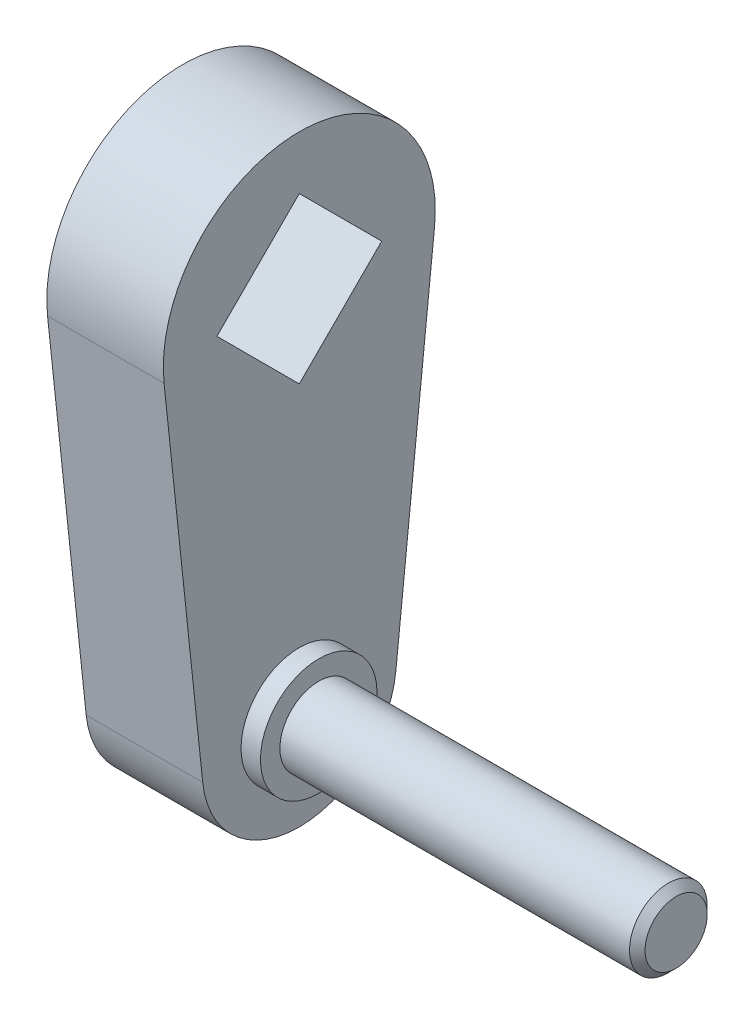
ISO-10303-21;
HEADER;
FILE_DESCRIPTION(('STEP AP214'),'2;1');
FILE_NAME('part.step','',(''),(''),'','','');
FILE_SCHEMA(('AUTOMOTIVE_DESIGN { 1 0 10303 214 1 1 1 1 }'));
ENDSEC;
DATA;
#1=APPLICATION_CONTEXT('core data for automotive mechanical design processes');
#2=APPLICATION_PROTOCOL_DEFINITION('international standard','automotive_design',2000,#1);
#3=PRODUCT_CONTEXT('',#1,'mechanical');
#4=PRODUCT('Part','Part','',(#3));
#5=PRODUCT_RELATED_PRODUCT_CATEGORY('part','',(#4));
#6=PRODUCT_DEFINITION_FORMATION('','',#4);
#7=PRODUCT_DEFINITION_CONTEXT('part definition',#1,'design');
#8=PRODUCT_DEFINITION('design','',#6,#7);
#9=PRODUCT_DEFINITION_SHAPE('','',#8);
#10=(LENGTH_UNIT() NAMED_UNIT(*) SI_UNIT(.MILLI.,.METRE.));
#11=(NAMED_UNIT(*) PLANE_ANGLE_UNIT() SI_UNIT($,.RADIAN.));
#12=(NAMED_UNIT(*) SI_UNIT($,.STERADIAN.) SOLID_ANGLE_UNIT());
#13=UNCERTAINTY_MEASURE_WITH_UNIT(LENGTH_MEASURE(1.E-05),#10,'distance_accuracy_value','');
#14=(GEOMETRIC_REPRESENTATION_CONTEXT(3) GLOBAL_UNCERTAINTY_ASSIGNED_CONTEXT((#13)) GLOBAL_UNIT_ASSIGNED_CONTEXT((#10,
#11,#12)) REPRESENTATION_CONTEXT('',''));
#15=CARTESIAN_POINT('',(0.,0.,0.));
#16=DIRECTION('',(0.,0.,1.));
#17=DIRECTION('',(1.,0.,0.));
#18=AXIS2_PLACEMENT_3D('',#15,#16,#17);
#19=CARTESIAN_POINT('',(5.,-95.,0.));
#20=DIRECTION('',(1.,0.,0.));
#21=DIRECTION('',(0.,0.,-1.));
#22=AXIS2_PLACEMENT_3D('',#19,#20,#21);
#23=PLANE('',#22);
#24=CARTESIAN_POINT('',(5.,-95.,0.));
#25=DIRECTION('',(1.,0.,0.));
#26=DIRECTION('',(0.,0.,-1.));
#27=AXIS2_PLACEMENT_3D('',#24,#25,#26);
#28=CIRCLE('',#27,15.);
#29=CARTESIAN_POINT('',(5.,-95.,-15.));
#30=VERTEX_POINT('',#29);
#31=EDGE_CURVE('E123',#30,#30,#28,.T.);
#32=ORIENTED_EDGE('',*,*,#31,.T.);
#33=EDGE_LOOP('',(#32));
#34=FACE_BOUND('',#33,.T.);
#35=CARTESIAN_POINT('',(5.,-95.,0.));
#36=DIRECTION('',(1.,0.,0.));
#37=DIRECTION('',(0.,0.,-1.));
#38=AXIS2_PLACEMENT_3D('',#35,#36,#37);
#39=CIRCLE('',#38,10.);
#40=CARTESIAN_POINT('',(5.,-95.,-10.));
#41=VERTEX_POINT('',#40);
#42=EDGE_CURVE('E364',#41,#41,#39,.T.);
#43=ORIENTED_EDGE('',*,*,#42,.F.);
#44=EDGE_LOOP('',(#43));
#45=FACE_BOUND('',#44,.T.);
#46=ADVANCED_FACE('F34',(#34,#45),#23,.T.);
#47=CARTESIAN_POINT('',(0.,0.,0.));
#48=DIRECTION('',(-1.,0.,0.));
#49=DIRECTION('',(0.,0.,1.));
#50=AXIS2_PLACEMENT_3D('',#47,#48,#49);
#51=PLANE('',#50);
#52=CARTESIAN_POINT('',(0.,0.,0.));
#53=DIRECTION('',(1.,0.,0.));
#54=DIRECTION('',(0.,0.,1.));
#55=AXIS2_PLACEMENT_3D('',#52,#53,#54);
#56=CIRCLE('',#55,35.);
#57=CARTESIAN_POINT('',(0.,-3.68421052631579,-34.8055540510101));
#58=VERTEX_POINT('',#57);
#59=CARTESIAN_POINT('',(0.,-3.68421052631579,34.8055540510101));
#60=VERTEX_POINT('',#59);
#61=EDGE_CURVE('E141',#58,#60,#56,.T.);
#62=ORIENTED_EDGE('',*,*,#61,.T.);
#63=DIRECTION('',(0.,-0.994444401457431,-0.105263157894737));
#64=VECTOR('',#63,1.);
#65=CARTESIAN_POINT('',(0.,-3.68421052631579,34.8055540510101));
#66=LINE('',#65,#64);
#67=CARTESIAN_POINT('',(0.,-97.6315789473684,24.8611100364358));
#68=VERTEX_POINT('',#67);
#69=EDGE_CURVE('E158',#60,#68,#66,.T.);
#70=ORIENTED_EDGE('',*,*,#69,.T.);
#71=CARTESIAN_POINT('',(0.,-95.,0.));
#72=DIRECTION('',(1.,0.,0.));
#73=DIRECTION('',(0.,0.,-1.));
#74=AXIS2_PLACEMENT_3D('',#71,#72,#73);
#75=CIRCLE('',#74,25.);
#76=CARTESIAN_POINT('',(0.,-97.6315789473684,-24.8611100364358));
#77=VERTEX_POINT('',#76);
#78=EDGE_CURVE('E161',#68,#77,#75,.T.);
#79=ORIENTED_EDGE('',*,*,#78,.T.);
#80=DIRECTION('',(0.,0.994444401457431,-0.105263157894737));
#81=VECTOR('',#80,1.);
#82=CARTESIAN_POINT('',(0.,-3.68421052631579,-34.8055540510101));
#83=LINE('',#82,#81);
#84=EDGE_CURVE('E146',#77,#58,#83,.T.);
#85=ORIENTED_EDGE('',*,*,#84,.T.);
#86=EDGE_LOOP('',(#62,#70,#79,#85));
#87=FACE_BOUND('',#86,.T.);
#88=DIRECTION('',(0.,-0.707106781186548,-0.707106781186547));
#89=VECTOR('',#88,1.);
#90=CARTESIAN_POINT('',(0.,-21.2132034355964,0.));
#91=LINE('',#90,#89);
#92=CARTESIAN_POINT('',(0.,0.,21.2132034355964));
#93=VERTEX_POINT('',#92);
#94=CARTESIAN_POINT('',(0.,-21.2132034355964,0.));
#95=VERTEX_POINT('',#94);
#96=EDGE_CURVE('E129',#93,#95,#91,.T.);
#97=ORIENTED_EDGE('',*,*,#96,.F.);
#98=DIRECTION('',(0.,-0.707106781186547,0.707106781186547));
#99=VECTOR('',#98,1.);
#100=CARTESIAN_POINT('',(0.,0.,21.2132034355964));
#101=LINE('',#100,#99);
#102=CARTESIAN_POINT('',(0.,21.2132034355964,0.));
#103=VERTEX_POINT('',#102);
#104=EDGE_CURVE('E57',#103,#93,#101,.T.);
#105=ORIENTED_EDGE('',*,*,#104,.F.);
#106=DIRECTION('',(0.,0.707106781186547,0.707106781186547));
#107=VECTOR('',#106,1.);
#108=CARTESIAN_POINT('',(0.,21.2132034355964,0.));
#109=LINE('',#108,#107);
#110=CARTESIAN_POINT('',(0.,0.,-21.2132034355964));
#111=VERTEX_POINT('',#110);
#112=EDGE_CURVE('E117',#111,#103,#109,.T.);
#113=ORIENTED_EDGE('',*,*,#112,.F.);
#114=DIRECTION('',(0.,0.707106781186548,-0.707106781186547));
#115=VECTOR('',#114,1.);
#116=CARTESIAN_POINT('',(0.,0.,-21.2132034355964));
#117=LINE('',#116,#115);
#118=EDGE_CURVE('E120',#95,#111,#117,.T.);
#119=ORIENTED_EDGE('',*,*,#118,.F.);
#120=EDGE_LOOP('',(#97,#105,#113,#119));
#121=FACE_BOUND('',#120,.T.);
#122=CARTESIAN_POINT('',(0.,-95.,0.));
#123=DIRECTION('',(-1.,0.,0.));
#124=DIRECTION('',(0.,0.,1.));
#125=AXIS2_PLACEMENT_3D('',#122,#123,#124);
#126=CIRCLE('',#125,15.);
#127=CARTESIAN_POINT('',(0.,-95.,15.));
#128=VERTEX_POINT('',#127);
#129=EDGE_CURVE('E176',#128,#128,#126,.F.);
#130=ORIENTED_EDGE('',*,*,#129,.F.);
#131=EDGE_LOOP('',(#130));
#132=FACE_BOUND('',#131,.T.);
#133=ADVANCED_FACE('F192',(#87,#121,#132),#51,.F.);
#134=CARTESIAN_POINT('',(-30.,-95.,0.));
#135=DIRECTION('',(1.,0.,0.));
#136=DIRECTION('',(0.,0.,-1.));
#137=AXIS2_PLACEMENT_3D('',#134,#135,#136);
#138=CYLINDRICAL_SURFACE('',#137,10.);
#139=CARTESIAN_POINT('',(-30.,-95.,0.));
#140=DIRECTION('',(1.,0.,0.));
#141=DIRECTION('',(0.,0.,-1.));
#142=AXIS2_PLACEMENT_3D('',#139,#140,#141);
#143=CIRCLE('',#142,10.);
#144=CARTESIAN_POINT('',(-30.,-95.,-10.));
#145=VERTEX_POINT('',#144);
#146=EDGE_CURVE('E135',#145,#145,#143,.T.);
#147=ORIENTED_EDGE('',*,*,#146,.F.);
#148=EDGE_LOOP('',(#147));
#149=FACE_BOUND('',#148,.T.);
#150=CARTESIAN_POINT('',(-28.,-95.,0.));
#151=DIRECTION('',(1.,0.,0.));
#152=DIRECTION('',(0.,0.,-1.));
#153=AXIS2_PLACEMENT_3D('',#150,#151,#152);
#154=CIRCLE('',#153,10.);
#155=CARTESIAN_POINT('',(-28.,-95.,-10.));
#156=VERTEX_POINT('',#155);
#157=EDGE_CURVE('E168',#156,#156,#154,.F.);
#158=ORIENTED_EDGE('',*,*,#157,.F.);
#159=EDGE_LOOP('',(#158));
#160=FACE_BOUND('',#159,.T.);
#161=ADVANCED_FACE('F198',(#149,#160),#138,.F.);
#162=CARTESIAN_POINT('',(-30.,0.,0.));
#163=DIRECTION('',(1.,0.,0.));
#164=DIRECTION('',(0.,0.,-1.));
#165=AXIS2_PLACEMENT_3D('',#162,#163,#164);
#166=CYLINDRICAL_SURFACE('',#165,35.);
#167=ORIENTED_EDGE('',*,*,#61,.F.);
#168=DIRECTION('',(1.,0.,0.));
#169=VECTOR('',#168,1.);
#170=CARTESIAN_POINT('',(-30.,-3.68421052631579,-34.8055540510101));
#171=LINE('',#170,#169);
#172=CARTESIAN_POINT('',(-30.,-3.68421052631579,-34.8055540510101));
#173=VERTEX_POINT('',#172);
#174=EDGE_CURVE('E166',#173,#58,#171,.T.);
#175=ORIENTED_EDGE('',*,*,#174,.F.);
#176=CARTESIAN_POINT('',(-30.,0.,0.));
#177=DIRECTION('',(1.,0.,0.));
#178=DIRECTION('',(0.,0.,1.));
#179=AXIS2_PLACEMENT_3D('',#176,#177,#178);
#180=CIRCLE('',#179,35.);
#181=CARTESIAN_POINT('',(-30.,-3.68421052631579,34.8055540510101));
#182=VERTEX_POINT('',#181);
#183=EDGE_CURVE('E142',#173,#182,#180,.T.);
#184=ORIENTED_EDGE('',*,*,#183,.T.);
#185=DIRECTION('',(1.,0.,0.));
#186=VECTOR('',#185,1.);
#187=CARTESIAN_POINT('',(-30.,-3.68421052631579,34.8055540510101));
#188=LINE('',#187,#186);
#189=EDGE_CURVE('E155',#182,#60,#188,.T.);
#190=ORIENTED_EDGE('',*,*,#189,.T.);
#191=EDGE_LOOP('',(#167,#175,#184,#190));
#192=FACE_BOUND('',#191,.T.);
#193=ADVANCED_FACE('F226',(#192),#166,.T.);
#194=CARTESIAN_POINT('',(-30.,-3.68421052631579,-34.8055540510101));
#195=DIRECTION('',(0.,-0.105263157894737,-0.994444401457431));
#196=DIRECTION('',(0.,0.994444401457431,-0.105263157894737));
#197=AXIS2_PLACEMENT_3D('',#194,#195,#196);
#198=PLANE('',#197);
#199=ORIENTED_EDGE('',*,*,#84,.F.);
#200=DIRECTION('',(1.,0.,0.));
#201=VECTOR('',#200,1.);
#202=CARTESIAN_POINT('',(-30.,-97.6315789473684,-24.8611100364358));
#203=LINE('',#202,#201);
#204=CARTESIAN_POINT('',(-30.,-97.6315789473684,-24.8611100364358));
#205=VERTEX_POINT('',#204);
#206=EDGE_CURVE('E169',#205,#77,#203,.T.);
#207=ORIENTED_EDGE('',*,*,#206,.F.);
#208=DIRECTION('',(0.,0.994444401457431,-0.105263157894737));
#209=VECTOR('',#208,1.);
#210=CARTESIAN_POINT('',(-30.,-3.68421052631579,-34.8055540510101));
#211=LINE('',#210,#209);
#212=EDGE_CURVE('E152',#205,#173,#211,.T.);
#213=ORIENTED_EDGE('',*,*,#212,.T.);
#214=ORIENTED_EDGE('',*,*,#174,.T.);
#215=EDGE_LOOP('',(#199,#207,#213,#214));
#216=FACE_BOUND('',#215,.T.);
#217=ADVANCED_FACE('F231',(#216),#198,.T.);
#218=CARTESIAN_POINT('',(-30.,-95.,0.));
#219=DIRECTION('',(1.,0.,0.));
#220=DIRECTION('',(0.,0.,-1.));
#221=AXIS2_PLACEMENT_3D('',#218,#219,#220);
#222=CYLINDRICAL_SURFACE('',#221,25.);
#223=ORIENTED_EDGE('',*,*,#78,.F.);
#224=DIRECTION('',(1.,0.,0.));
#225=VECTOR('',#224,1.);
#226=CARTESIAN_POINT('',(-30.,-97.6315789473684,24.8611100364358));
#227=LINE('',#226,#225);
#228=CARTESIAN_POINT('',(-30.,-97.6315789473684,24.8611100364358));
#229=VERTEX_POINT('',#228);
#230=EDGE_CURVE('E171',#229,#68,#227,.T.);
#231=ORIENTED_EDGE('',*,*,#230,.F.);
#232=CARTESIAN_POINT('',(-30.,-95.,0.));
#233=DIRECTION('',(1.,0.,0.));
#234=DIRECTION('',(0.,0.,-1.));
#235=AXIS2_PLACEMENT_3D('',#232,#233,#234);
#236=CIRCLE('',#235,25.);
#237=EDGE_CURVE('E149',#229,#205,#236,.T.);
#238=ORIENTED_EDGE('',*,*,#237,.T.);
#239=ORIENTED_EDGE('',*,*,#206,.T.);
#240=EDGE_LOOP('',(#223,#231,#238,#239));
#241=FACE_BOUND('',#240,.T.);
#242=ADVANCED_FACE('F234',(#241),#222,.T.);
#243=CARTESIAN_POINT('',(-30.,-3.68421052631579,34.8055540510101));
#244=DIRECTION('',(0.,-0.105263157894737,0.994444401457431));
#245=DIRECTION('',(0.,-0.994444401457431,-0.105263157894737));
#246=AXIS2_PLACEMENT_3D('',#243,#244,#245);
#247=PLANE('',#246);
#248=ORIENTED_EDGE('',*,*,#69,.F.);
#249=ORIENTED_EDGE('',*,*,#189,.F.);
#250=DIRECTION('',(0.,-0.994444401457431,-0.105263157894737));
#251=VECTOR('',#250,1.);
#252=CARTESIAN_POINT('',(-30.,-3.68421052631579,34.8055540510101));
#253=LINE('',#252,#251);
#254=EDGE_CURVE('E145',#182,#229,#253,.T.);
#255=ORIENTED_EDGE('',*,*,#254,.T.);
#256=ORIENTED_EDGE('',*,*,#230,.T.);
#257=EDGE_LOOP('',(#248,#249,#255,#256));
#258=FACE_BOUND('',#257,.T.);
#259=ADVANCED_FACE('F229',(#258),#247,.T.);
#260=CARTESIAN_POINT('',(-30.,0.,0.));
#261=DIRECTION('',(-1.,0.,0.));
#262=DIRECTION('',(0.,0.,1.));
#263=AXIS2_PLACEMENT_3D('',#260,#261,#262);
#264=PLANE('',#263);
#265=DIRECTION('',(0.,-0.707106781186547,0.707106781186547));
#266=VECTOR('',#265,1.);
#267=CARTESIAN_POINT('',(-30.,0.,21.2132034355964));
#268=LINE('',#267,#266);
#269=CARTESIAN_POINT('',(-30.,21.2132034355964,0.));
#270=VERTEX_POINT('',#269);
#271=CARTESIAN_POINT('',(-30.,0.,21.2132034355964));
#272=VERTEX_POINT('',#271);
#273=EDGE_CURVE('E101',#270,#272,#268,.T.);
#274=ORIENTED_EDGE('',*,*,#273,.T.);
#275=DIRECTION('',(0.,-0.707106781186548,-0.707106781186547));
#276=VECTOR('',#275,1.);
#277=CARTESIAN_POINT('',(-30.,-21.2132034355964,0.));
#278=LINE('',#277,#276);
#279=CARTESIAN_POINT('',(-30.,-21.2132034355964,0.));
#280=VERTEX_POINT('',#279);
#281=EDGE_CURVE('E110',#272,#280,#278,.T.);
#282=ORIENTED_EDGE('',*,*,#281,.T.);
#283=DIRECTION('',(0.,0.707106781186548,-0.707106781186547));
#284=VECTOR('',#283,1.);
#285=CARTESIAN_POINT('',(-30.,0.,-21.2132034355964));
#286=LINE('',#285,#284);
#287=CARTESIAN_POINT('',(-30.,0.,-21.2132034355964));
#288=VERTEX_POINT('',#287);
#289=EDGE_CURVE('E49',#280,#288,#286,.T.);
#290=ORIENTED_EDGE('',*,*,#289,.T.);
#291=DIRECTION('',(0.,0.707106781186547,0.707106781186547));
#292=VECTOR('',#291,1.);
#293=CARTESIAN_POINT('',(-30.,21.2132034355964,0.));
#294=LINE('',#293,#292);
#295=EDGE_CURVE('E107',#288,#270,#294,.T.);
#296=ORIENTED_EDGE('',*,*,#295,.T.);
#297=EDGE_LOOP('',(#274,#282,#290,#296));
#298=FACE_BOUND('',#297,.T.);
#299=ORIENTED_EDGE('',*,*,#146,.T.);
#300=EDGE_LOOP('',(#299));
#301=FACE_BOUND('',#300,.T.);
#302=ORIENTED_EDGE('',*,*,#183,.F.);
#303=ORIENTED_EDGE('',*,*,#212,.F.);
#304=ORIENTED_EDGE('',*,*,#237,.F.);
#305=ORIENTED_EDGE('',*,*,#254,.F.);
#306=EDGE_LOOP('',(#302,#303,#304,#305));
#307=FACE_BOUND('',#306,.T.);
#308=ADVANCED_FACE('F114',(#298,#301,#307),#264,.T.);
#309=CARTESIAN_POINT('',(-30.,0.,21.2132034355964));
#310=DIRECTION('',(0.,0.707106781186547,0.707106781186547));
#311=DIRECTION('',(0.,-0.707106781186547,0.707106781186548));
#312=AXIS2_PLACEMENT_3D('',#309,#310,#311);
#313=PLANE('',#312);
#314=ORIENTED_EDGE('',*,*,#104,.T.);
#315=DIRECTION('',(1.,0.,0.));
#316=VECTOR('',#315,1.);
#317=CARTESIAN_POINT('',(-30.,0.,21.2132034355964));
#318=LINE('',#317,#316);
#319=EDGE_CURVE('E97',#272,#93,#318,.T.);
#320=ORIENTED_EDGE('',*,*,#319,.F.);
#321=ORIENTED_EDGE('',*,*,#273,.F.);
#322=DIRECTION('',(1.,0.,0.));
#323=VECTOR('',#322,1.);
#324=CARTESIAN_POINT('',(-30.,21.2132034355964,0.));
#325=LINE('',#324,#323);
#326=EDGE_CURVE('E133',#270,#103,#325,.T.);
#327=ORIENTED_EDGE('',*,*,#326,.T.);
#328=EDGE_LOOP('',(#314,#320,#321,#327));
#329=FACE_BOUND('',#328,.T.);
#330=ADVANCED_FACE('F99',(#329),#313,.F.);
#331=CARTESIAN_POINT('',(-30.,21.2132034355964,0.));
#332=DIRECTION('',(0.,0.707106781186547,-0.707106781186547));
#333=DIRECTION('',(0.,0.707106781186548,0.707106781186548));
#334=AXIS2_PLACEMENT_3D('',#331,#332,#333);
#335=PLANE('',#334);
#336=ORIENTED_EDGE('',*,*,#112,.T.);
#337=ORIENTED_EDGE('',*,*,#326,.F.);
#338=ORIENTED_EDGE('',*,*,#295,.F.);
#339=DIRECTION('',(1.,0.,0.));
#340=VECTOR('',#339,1.);
#341=CARTESIAN_POINT('',(-30.,0.,-21.2132034355964));
#342=LINE('',#341,#340);
#343=EDGE_CURVE('E136',#288,#111,#342,.T.);
#344=ORIENTED_EDGE('',*,*,#343,.T.);
#345=EDGE_LOOP('',(#336,#337,#338,#344));
#346=FACE_BOUND('',#345,.T.);
#347=ADVANCED_FACE('F213',(#346),#335,.F.);
#348=CARTESIAN_POINT('',(-30.,0.,-21.2132034355964));
#349=DIRECTION('',(0.,-0.707106781186547,-0.707106781186548));
#350=DIRECTION('',(0.,0.707106781186548,-0.707106781186547));
#351=AXIS2_PLACEMENT_3D('',#348,#349,#350);
#352=PLANE('',#351);
#353=ORIENTED_EDGE('',*,*,#118,.T.);
#354=ORIENTED_EDGE('',*,*,#343,.F.);
#355=ORIENTED_EDGE('',*,*,#289,.F.);
#356=DIRECTION('',(1.,0.,0.));
#357=VECTOR('',#356,1.);
#358=CARTESIAN_POINT('',(-30.,-21.2132034355964,0.));
#359=LINE('',#358,#357);
#360=EDGE_CURVE('E106',#280,#95,#359,.T.);
#361=ORIENTED_EDGE('',*,*,#360,.T.);
#362=EDGE_LOOP('',(#353,#354,#355,#361));
#363=FACE_BOUND('',#362,.T.);
#364=ADVANCED_FACE('F216',(#363),#352,.F.);
#365=CARTESIAN_POINT('',(-30.,-21.2132034355964,0.));
#366=DIRECTION('',(0.,-0.707106781186547,0.707106781186548));
#367=DIRECTION('',(0.,-0.707106781186548,-0.707106781186547));
#368=AXIS2_PLACEMENT_3D('',#365,#366,#367);
#369=PLANE('',#368);
#370=ORIENTED_EDGE('',*,*,#96,.T.);
#371=ORIENTED_EDGE('',*,*,#360,.F.);
#372=ORIENTED_EDGE('',*,*,#281,.F.);
#373=ORIENTED_EDGE('',*,*,#319,.T.);
#374=EDGE_LOOP('',(#370,#371,#372,#373));
#375=FACE_BOUND('',#374,.T.);
#376=ADVANCED_FACE('F111',(#375),#369,.F.);
#377=CARTESIAN_POINT('',(-28.,-95.,0.));
#378=DIRECTION('',(1.,0.,0.));
#379=DIRECTION('',(0.,0.,-1.));
#380=AXIS2_PLACEMENT_3D('',#377,#378,#379);
#381=PLANE('',#380);
#382=ORIENTED_EDGE('',*,*,#157,.T.);
#383=EDGE_LOOP('',(#382));
#384=FACE_BOUND('',#383,.T.);
#385=ADVANCED_FACE('F208',(#384),#381,.F.);
#386=CARTESIAN_POINT('',(5.,-95.,0.));
#387=DIRECTION('',(-1.,0.,0.));
#388=DIRECTION('',(0.,0.,1.));
#389=AXIS2_PLACEMENT_3D('',#386,#387,#388);
#390=CYLINDRICAL_SURFACE('',#389,15.);
#391=ORIENTED_EDGE('',*,*,#31,.F.);
#392=EDGE_LOOP('',(#391));
#393=FACE_BOUND('',#392,.T.);
#394=ORIENTED_EDGE('',*,*,#129,.T.);
#395=EDGE_LOOP('',(#394));
#396=FACE_BOUND('',#395,.T.);
#397=ADVANCED_FACE('F205',(#393,#396),#390,.T.);
#398=CARTESIAN_POINT('',(97.,-95.,0.));
#399=DIRECTION('',(-1.,0.,0.));
#400=DIRECTION('',(0.,0.,1.));
#401=AXIS2_PLACEMENT_3D('',#398,#399,#400);
#402=CYLINDRICAL_SURFACE('',#401,10.);
#403=CARTESIAN_POINT('',(95.,-95.,0.));
#404=DIRECTION('',(1.,0.,0.));
#405=DIRECTION('',(0.,0.,-1.));
#406=AXIS2_PLACEMENT_3D('',#403,#404,#405);
#407=CIRCLE('',#406,10.);
#408=CARTESIAN_POINT('',(95.,-95.,-10.));
#409=VERTEX_POINT('',#408);
#410=EDGE_CURVE('E11',#409,#409,#407,.F.);
#411=ORIENTED_EDGE('',*,*,#410,.T.);
#412=EDGE_LOOP('',(#411));
#413=FACE_BOUND('',#412,.T.);
#414=ORIENTED_EDGE('',*,*,#42,.T.);
#415=EDGE_LOOP('',(#414));
#416=FACE_BOUND('',#415,.T.);
#417=ADVANCED_FACE('F188',(#413,#416),#402,.T.);
#418=CARTESIAN_POINT('',(97.,-95.,0.));
#419=DIRECTION('',(1.,0.,0.));
#420=DIRECTION('',(0.,0.,-1.));
#421=AXIS2_PLACEMENT_3D('',#418,#419,#420);
#422=PLANE('',#421);
#423=CARTESIAN_POINT('',(97.,-95.,0.));
#424=DIRECTION('',(1.,0.,0.));
#425=DIRECTION('',(0.,0.,-1.));
#426=AXIS2_PLACEMENT_3D('',#423,#424,#425);
#427=CIRCLE('',#426,8.00000000000001);
#428=CARTESIAN_POINT('',(97.,-95.,-8.00000000000001));
#429=VERTEX_POINT('',#428);
#430=EDGE_CURVE('E42',#429,#429,#427,.T.);
#431=ORIENTED_EDGE('',*,*,#430,.T.);
#432=EDGE_LOOP('',(#431));
#433=FACE_BOUND('',#432,.T.);
#434=ADVANCED_FACE('F181',(#433),#422,.T.);
#435=CARTESIAN_POINT('',(97.,-95.,0.));
#436=DIRECTION('',(-1.,0.,0.));
#437=DIRECTION('',(0.,0.,1.));
#438=AXIS2_PLACEMENT_3D('',#435,#436,#437);
#439=CONICAL_SURFACE('',#438,8.00000000000001,0.785398163397446);
#440=ORIENTED_EDGE('',*,*,#410,.F.);
#441=EDGE_LOOP('',(#440));
#442=FACE_BOUND('',#441,.T.);
#443=ORIENTED_EDGE('',*,*,#430,.F.);
#444=EDGE_LOOP('',(#443));
#445=FACE_BOUND('',#444,.T.);
#446=ADVANCED_FACE('F36',(#442,#445),#439,.T.);
#447=CLOSED_SHELL('',(#46,#133,#161,#193,#217,#242,#259,#308,#330,#347,#364,#376,#385,#397,#417,
#434,#446));
#448=MANIFOLD_SOLID_BREP('B2',#447);
#449=ADVANCED_BREP_SHAPE_REPRESENTATION('',(#18,#448),#14);
#450=SHAPE_DEFINITION_REPRESENTATION(#9,#449);
ENDSEC;
END-ISO-10303-21;
